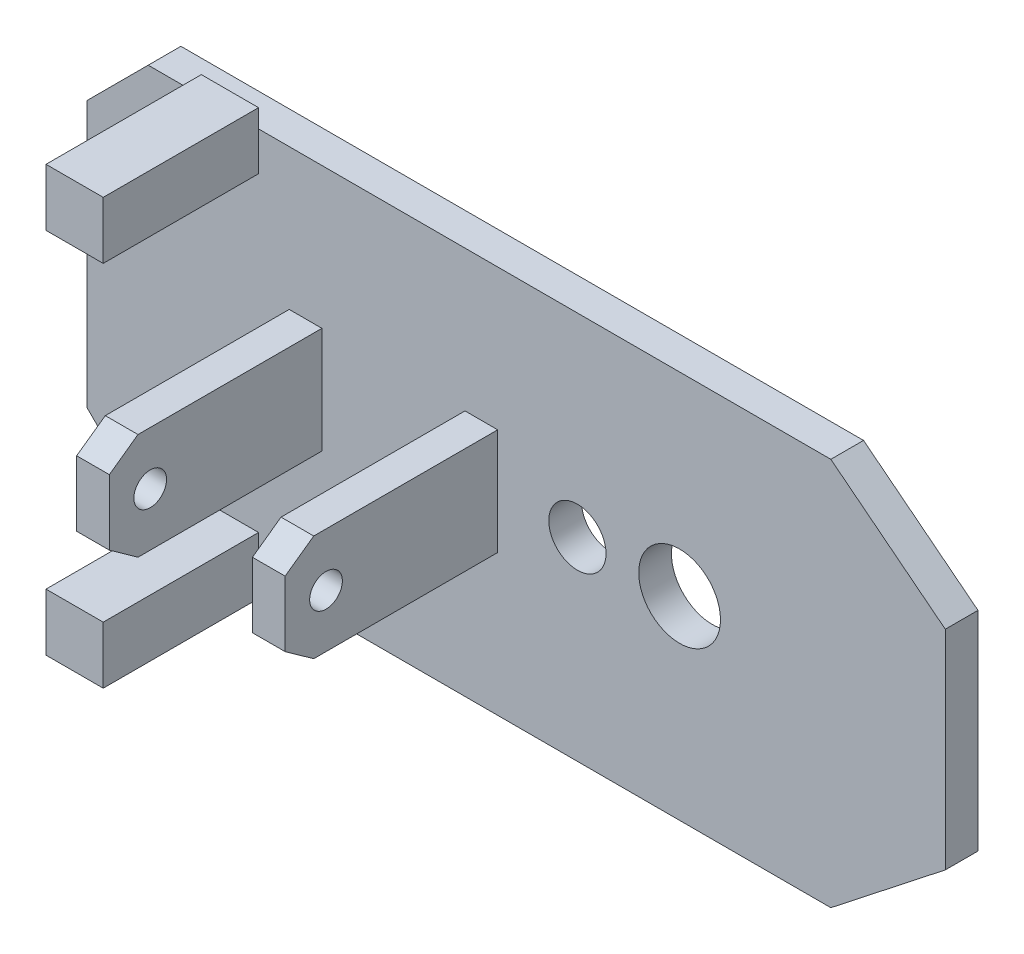
ISO-10303-21;
HEADER;
FILE_DESCRIPTION(('STEP AP214'),'2;1');
FILE_NAME('part.step','',(''),(''),'','','');
FILE_SCHEMA(('AUTOMOTIVE_DESIGN { 1 0 10303 214 1 1 1 1 }'));
ENDSEC;
DATA;
#1=APPLICATION_CONTEXT('core data for automotive mechanical design processes');
#2=APPLICATION_PROTOCOL_DEFINITION('international standard','automotive_design',2000,#1);
#3=PRODUCT_CONTEXT('',#1,'mechanical');
#4=PRODUCT('Part','Part','',(#3));
#5=PRODUCT_RELATED_PRODUCT_CATEGORY('part','',(#4));
#6=PRODUCT_DEFINITION_FORMATION('','',#4);
#7=PRODUCT_DEFINITION_CONTEXT('part definition',#1,'design');
#8=PRODUCT_DEFINITION('design','',#6,#7);
#9=PRODUCT_DEFINITION_SHAPE('','',#8);
#10=(LENGTH_UNIT() NAMED_UNIT(*) SI_UNIT(.MILLI.,.METRE.));
#11=(NAMED_UNIT(*) PLANE_ANGLE_UNIT() SI_UNIT($,.RADIAN.));
#12=(NAMED_UNIT(*) SI_UNIT($,.STERADIAN.) SOLID_ANGLE_UNIT());
#13=UNCERTAINTY_MEASURE_WITH_UNIT(LENGTH_MEASURE(1.E-05),#10,'distance_accuracy_value','');
#14=(GEOMETRIC_REPRESENTATION_CONTEXT(3) GLOBAL_UNCERTAINTY_ASSIGNED_CONTEXT((#13)) GLOBAL_UNIT_ASSIGNED_CONTEXT((#10,
#11,#12)) REPRESENTATION_CONTEXT('',''));
#15=CARTESIAN_POINT('',(0.,0.,0.));
#16=DIRECTION('',(0.,0.,1.));
#17=DIRECTION('',(1.,0.,0.));
#18=AXIS2_PLACEMENT_3D('',#15,#16,#17);
#19=CARTESIAN_POINT('',(0.,0.,-42.));
#20=DIRECTION('',(0.,0.,-1.));
#21=DIRECTION('',(-1.,0.,0.));
#22=AXIS2_PLACEMENT_3D('',#19,#20,#21);
#23=PLANE('',#22);
#24=DIRECTION('',(0.,1.,0.));
#25=VECTOR('',#24,1.);
#26=CARTESIAN_POINT('',(-17.5,-13.,-42.));
#27=LINE('',#26,#25);
#28=CARTESIAN_POINT('',(-17.5,-13.,-42.));
#29=VERTEX_POINT('',#28);
#30=CARTESIAN_POINT('',(-17.5,13.,-42.));
#31=VERTEX_POINT('',#30);
#32=EDGE_CURVE('E310',#29,#31,#27,.T.);
#33=ORIENTED_EDGE('',*,*,#32,.F.);
#34=DIRECTION('',(-1.,0.,0.));
#35=VECTOR('',#34,1.);
#36=CARTESIAN_POINT('',(-17.5,-13.,-42.));
#37=LINE('',#36,#35);
#38=CARTESIAN_POINT('',(-25.5,-13.,-42.));
#39=VERTEX_POINT('',#38);
#40=EDGE_CURVE('E350',#29,#39,#37,.T.);
#41=ORIENTED_EDGE('',*,*,#40,.T.);
#42=DIRECTION('',(0.,1.,0.));
#43=VECTOR('',#42,1.);
#44=CARTESIAN_POINT('',(-25.5,-13.,-42.));
#45=LINE('',#44,#43);
#46=CARTESIAN_POINT('',(-25.5,13.,-42.));
#47=VERTEX_POINT('',#46);
#48=EDGE_CURVE('E322',#39,#47,#45,.T.);
#49=ORIENTED_EDGE('',*,*,#48,.T.);
#50=DIRECTION('',(-1.,0.,0.));
#51=VECTOR('',#50,1.);
#52=CARTESIAN_POINT('',(-17.5,13.,-42.));
#53=LINE('',#52,#51);
#54=EDGE_CURVE('E343',#31,#47,#53,.T.);
#55=ORIENTED_EDGE('',*,*,#54,.F.);
#56=EDGE_LOOP('',(#33,#41,#49,#55));
#57=FACE_BOUND('',#56,.T.);
#58=DIRECTION('',(-1.,0.,0.));
#59=VECTOR('',#58,1.);
#60=CARTESIAN_POINT('',(25.5,-13.,-42.));
#61=LINE('',#60,#59);
#62=CARTESIAN_POINT('',(25.5,-13.,-42.));
#63=VERTEX_POINT('',#62);
#64=CARTESIAN_POINT('',(17.5,-13.,-42.));
#65=VERTEX_POINT('',#64);
#66=EDGE_CURVE('E393',#63,#65,#61,.T.);
#67=ORIENTED_EDGE('',*,*,#66,.T.);
#68=DIRECTION('',(0.,1.,0.));
#69=VECTOR('',#68,1.);
#70=CARTESIAN_POINT('',(17.5,-13.,-42.));
#71=LINE('',#70,#69);
#72=CARTESIAN_POINT('',(17.5,13.,-42.));
#73=VERTEX_POINT('',#72);
#74=EDGE_CURVE('E371',#65,#73,#71,.T.);
#75=ORIENTED_EDGE('',*,*,#74,.T.);
#76=DIRECTION('',(-1.,0.,0.));
#77=VECTOR('',#76,1.);
#78=CARTESIAN_POINT('',(25.5,13.,-42.));
#79=LINE('',#78,#77);
#80=CARTESIAN_POINT('',(25.5,13.,-42.));
#81=VERTEX_POINT('',#80);
#82=EDGE_CURVE('E395',#81,#73,#79,.T.);
#83=ORIENTED_EDGE('',*,*,#82,.F.);
#84=DIRECTION('',(0.,1.,0.));
#85=VECTOR('',#84,1.);
#86=CARTESIAN_POINT('',(25.5,-13.,-42.));
#87=LINE('',#86,#85);
#88=EDGE_CURVE('E359',#63,#81,#87,.T.);
#89=ORIENTED_EDGE('',*,*,#88,.F.);
#90=EDGE_LOOP('',(#67,#75,#83,#89));
#91=FACE_BOUND('',#90,.T.);
#92=CARTESIAN_POINT('',(70.,0.,-42.));
#93=DIRECTION('',(0.,0.,1.));
#94=DIRECTION('',(1.,0.,0.));
#95=AXIS2_PLACEMENT_3D('',#92,#93,#94);
#96=CIRCLE('',#95,9.99999999999999);
#97=CARTESIAN_POINT('',(80.,0.,-42.));
#98=VERTEX_POINT('',#97);
#99=EDGE_CURVE('E404',#98,#98,#96,.T.);
#100=ORIENTED_EDGE('',*,*,#99,.F.);
#101=EDGE_LOOP('',(#100));
#102=FACE_BOUND('',#101,.T.);
#103=CARTESIAN_POINT('',(45.,0.,-42.));
#104=DIRECTION('',(0.,0.,1.));
#105=DIRECTION('',(1.,0.,0.));
#106=AXIS2_PLACEMENT_3D('',#103,#104,#105);
#107=CIRCLE('',#106,7.);
#108=CARTESIAN_POINT('',(52.,0.,-42.));
#109=VERTEX_POINT('',#108);
#110=EDGE_CURVE('E397',#109,#109,#107,.T.);
#111=ORIENTED_EDGE('',*,*,#110,.F.);
#112=EDGE_LOOP('',(#111));
#113=FACE_BOUND('',#112,.T.);
#114=DIRECTION('',(0.,-1.,0.));
#115=VECTOR('',#114,1.);
#116=CARTESIAN_POINT('',(-47.,-38.,-42.));
#117=LINE('',#116,#115);
#118=CARTESIAN_POINT('',(-47.,-38.,-42.));
#119=VERTEX_POINT('',#118);
#120=CARTESIAN_POINT('',(-47.,-47.5,-42.));
#121=VERTEX_POINT('',#120);
#122=EDGE_CURVE('E534',#119,#121,#117,.T.);
#123=ORIENTED_EDGE('',*,*,#122,.F.);
#124=DIRECTION('',(-1.,0.,0.));
#125=VECTOR('',#124,1.);
#126=CARTESIAN_POINT('',(-33.,-38.,-42.));
#127=LINE('',#126,#125);
#128=CARTESIAN_POINT('',(-33.,-38.,-42.));
#129=VERTEX_POINT('',#128);
#130=EDGE_CURVE('E59',#129,#119,#127,.T.);
#131=ORIENTED_EDGE('',*,*,#130,.F.);
#132=DIRECTION('',(0.,1.,0.));
#133=VECTOR('',#132,1.);
#134=CARTESIAN_POINT('',(-33.,-52.,-42.));
#135=LINE('',#134,#133);
#136=CARTESIAN_POINT('',(-33.,-47.5,-42.));
#137=VERTEX_POINT('',#136);
#138=EDGE_CURVE('E11',#137,#129,#135,.T.);
#139=ORIENTED_EDGE('',*,*,#138,.F.);
#140=DIRECTION('',(1.,0.,0.));
#141=VECTOR('',#140,1.);
#142=CARTESIAN_POINT('',(-60.,-47.5,-42.));
#143=LINE('',#142,#141);
#144=CARTESIAN_POINT('',(107.,-47.5,-42.));
#145=VERTEX_POINT('',#144);
#146=EDGE_CURVE('E414',#137,#145,#143,.T.);
#147=ORIENTED_EDGE('',*,*,#146,.T.);
#148=DIRECTION('',(0.786318338822423,0.617821551931904,0.));
#149=VECTOR('',#148,1.);
#150=CARTESIAN_POINT('',(107.,-47.5,-42.));
#151=LINE('',#150,#149);
#152=CARTESIAN_POINT('',(135.,-25.5,-42.));
#153=VERTEX_POINT('',#152);
#154=EDGE_CURVE('E416',#145,#153,#151,.T.);
#155=ORIENTED_EDGE('',*,*,#154,.T.);
#156=DIRECTION('',(0.,1.,0.));
#157=VECTOR('',#156,1.);
#158=CARTESIAN_POINT('',(135.,-25.5,-42.));
#159=LINE('',#158,#157);
#160=CARTESIAN_POINT('',(135.,25.5,-42.));
#161=VERTEX_POINT('',#160);
#162=EDGE_CURVE('E423',#153,#161,#159,.T.);
#163=ORIENTED_EDGE('',*,*,#162,.T.);
#164=DIRECTION('',(-0.786318338822423,0.617821551931904,0.));
#165=VECTOR('',#164,1.);
#166=CARTESIAN_POINT('',(135.,25.5,-42.));
#167=LINE('',#166,#165);
#168=CARTESIAN_POINT('',(107.,47.5,-42.));
#169=VERTEX_POINT('',#168);
#170=EDGE_CURVE('E421',#161,#169,#167,.T.);
#171=ORIENTED_EDGE('',*,*,#170,.T.);
#172=DIRECTION('',(-1.,0.,0.));
#173=VECTOR('',#172,1.);
#174=CARTESIAN_POINT('',(107.,47.5,-42.));
#175=LINE('',#174,#173);
#176=CARTESIAN_POINT('',(-32.9999999999999,47.5,-42.));
#177=VERTEX_POINT('',#176);
#178=EDGE_CURVE('E426',#169,#177,#175,.T.);
#179=ORIENTED_EDGE('',*,*,#178,.T.);
#180=DIRECTION('',(0.,1.,0.));
#181=VECTOR('',#180,1.);
#182=CARTESIAN_POINT('',(-33.,38.,-42.));
#183=LINE('',#182,#181);
#184=CARTESIAN_POINT('',(-33.,38.,-42.));
#185=VERTEX_POINT('',#184);
#186=EDGE_CURVE('E283',#185,#177,#183,.T.);
#187=ORIENTED_EDGE('',*,*,#186,.F.);
#188=DIRECTION('',(1.,0.,0.));
#189=VECTOR('',#188,1.);
#190=CARTESIAN_POINT('',(-47.,38.,-42.));
#191=LINE('',#190,#189);
#192=CARTESIAN_POINT('',(-47.,38.,-42.));
#193=VERTEX_POINT('',#192);
#194=EDGE_CURVE('E262',#193,#185,#191,.T.);
#195=ORIENTED_EDGE('',*,*,#194,.F.);
#196=DIRECTION('',(0.,-1.,0.));
#197=VECTOR('',#196,1.);
#198=CARTESIAN_POINT('',(-47.,52.,-42.));
#199=LINE('',#198,#197);
#200=CARTESIAN_POINT('',(-47.,47.5,-42.));
#201=VERTEX_POINT('',#200);
#202=EDGE_CURVE('E47',#201,#193,#199,.T.);
#203=ORIENTED_EDGE('',*,*,#202,.F.);
#204=CARTESIAN_POINT('',(-60.,47.5,-42.));
#205=VERTEX_POINT('',#204);
#206=EDGE_CURVE('E422',#201,#205,#175,.T.);
#207=ORIENTED_EDGE('',*,*,#206,.T.);
#208=DIRECTION('',(-0.707106781186547,-0.707106781186547,0.));
#209=VECTOR('',#208,1.);
#210=CARTESIAN_POINT('',(-60.,47.5,-42.));
#211=LINE('',#210,#209);
#212=CARTESIAN_POINT('',(-75.,32.5,-42.));
#213=VERTEX_POINT('',#212);
#214=EDGE_CURVE('E427',#205,#213,#211,.T.);
#215=ORIENTED_EDGE('',*,*,#214,.T.);
#216=DIRECTION('',(0.,-1.,0.));
#217=VECTOR('',#216,1.);
#218=CARTESIAN_POINT('',(-75.,32.5,-42.));
#219=LINE('',#218,#217);
#220=CARTESIAN_POINT('',(-75.,-32.5,-42.));
#221=VERTEX_POINT('',#220);
#222=EDGE_CURVE('E435',#213,#221,#219,.T.);
#223=ORIENTED_EDGE('',*,*,#222,.T.);
#224=DIRECTION('',(0.707106781186547,-0.707106781186547,0.));
#225=VECTOR('',#224,1.);
#226=CARTESIAN_POINT('',(-75.,-32.5,-42.));
#227=LINE('',#226,#225);
#228=CARTESIAN_POINT('',(-60.,-47.5,-42.));
#229=VERTEX_POINT('',#228);
#230=EDGE_CURVE('E409',#221,#229,#227,.T.);
#231=ORIENTED_EDGE('',*,*,#230,.T.);
#232=EDGE_CURVE('E413',#229,#121,#143,.T.);
#233=ORIENTED_EDGE('',*,*,#232,.T.);
#234=EDGE_LOOP('',(#123,#131,#139,#147,#155,#163,#171,#179,#187,#195,#203,#207,#215,#223,#231,#233));
#235=FACE_BOUND('',#234,.T.);
#236=ADVANCED_FACE('F37',(#57,#91,#102,#113,#235),#23,.F.);
#237=CARTESIAN_POINT('',(0.,0.,-50.));
#238=DIRECTION('',(0.,0.,-1.));
#239=DIRECTION('',(-1.,0.,0.));
#240=AXIS2_PLACEMENT_3D('',#237,#238,#239);
#241=PLANE('',#240);
#242=CARTESIAN_POINT('',(70.,0.,-50.));
#243=DIRECTION('',(0.,0.,1.));
#244=DIRECTION('',(1.,0.,0.));
#245=AXIS2_PLACEMENT_3D('',#242,#243,#244);
#246=CIRCLE('',#245,9.99999999999999);
#247=CARTESIAN_POINT('',(80.,0.,-50.));
#248=VERTEX_POINT('',#247);
#249=EDGE_CURVE('E402',#248,#248,#246,.T.);
#250=ORIENTED_EDGE('',*,*,#249,.T.);
#251=EDGE_LOOP('',(#250));
#252=FACE_BOUND('',#251,.T.);
#253=DIRECTION('',(0.707106781186547,-0.707106781186547,0.));
#254=VECTOR('',#253,1.);
#255=CARTESIAN_POINT('',(-75.,-32.5,-50.));
#256=LINE('',#255,#254);
#257=CARTESIAN_POINT('',(-75.,-32.5,-50.));
#258=VERTEX_POINT('',#257);
#259=CARTESIAN_POINT('',(-60.,-47.5,-50.));
#260=VERTEX_POINT('',#259);
#261=EDGE_CURVE('E410',#258,#260,#256,.T.);
#262=ORIENTED_EDGE('',*,*,#261,.F.);
#263=DIRECTION('',(0.,-1.,0.));
#264=VECTOR('',#263,1.);
#265=CARTESIAN_POINT('',(-75.,32.5,-50.));
#266=LINE('',#265,#264);
#267=CARTESIAN_POINT('',(-75.,32.5,-50.));
#268=VERTEX_POINT('',#267);
#269=EDGE_CURVE('E411',#268,#258,#266,.T.);
#270=ORIENTED_EDGE('',*,*,#269,.F.);
#271=DIRECTION('',(-0.707106781186547,-0.707106781186547,0.));
#272=VECTOR('',#271,1.);
#273=CARTESIAN_POINT('',(-60.,47.5,-50.));
#274=LINE('',#273,#272);
#275=CARTESIAN_POINT('',(-60.,47.5,-50.));
#276=VERTEX_POINT('',#275);
#277=EDGE_CURVE('E450',#276,#268,#274,.T.);
#278=ORIENTED_EDGE('',*,*,#277,.F.);
#279=DIRECTION('',(-1.,0.,0.));
#280=VECTOR('',#279,1.);
#281=CARTESIAN_POINT('',(107.,47.5,-50.));
#282=LINE('',#281,#280);
#283=CARTESIAN_POINT('',(107.,47.5,-50.));
#284=VERTEX_POINT('',#283);
#285=EDGE_CURVE('E443',#284,#276,#282,.T.);
#286=ORIENTED_EDGE('',*,*,#285,.F.);
#287=DIRECTION('',(-0.786318338822423,0.617821551931904,0.));
#288=VECTOR('',#287,1.);
#289=CARTESIAN_POINT('',(135.,25.5,-50.));
#290=LINE('',#289,#288);
#291=CARTESIAN_POINT('',(135.,25.5,-50.));
#292=VERTEX_POINT('',#291);
#293=EDGE_CURVE('E444',#292,#284,#290,.T.);
#294=ORIENTED_EDGE('',*,*,#293,.F.);
#295=DIRECTION('',(0.,1.,0.));
#296=VECTOR('',#295,1.);
#297=CARTESIAN_POINT('',(135.,-25.5,-50.));
#298=LINE('',#297,#296);
#299=CARTESIAN_POINT('',(135.,-25.5,-50.));
#300=VERTEX_POINT('',#299);
#301=EDGE_CURVE('E442',#300,#292,#298,.T.);
#302=ORIENTED_EDGE('',*,*,#301,.F.);
#303=DIRECTION('',(0.786318338822423,0.617821551931904,0.));
#304=VECTOR('',#303,1.);
#305=CARTESIAN_POINT('',(107.,-47.5,-50.));
#306=LINE('',#305,#304);
#307=CARTESIAN_POINT('',(107.,-47.5,-50.));
#308=VERTEX_POINT('',#307);
#309=EDGE_CURVE('E438',#308,#300,#306,.T.);
#310=ORIENTED_EDGE('',*,*,#309,.F.);
#311=DIRECTION('',(1.,0.,0.));
#312=VECTOR('',#311,1.);
#313=CARTESIAN_POINT('',(-60.,-47.5,-50.));
#314=LINE('',#313,#312);
#315=EDGE_CURVE('E440',#260,#308,#314,.T.);
#316=ORIENTED_EDGE('',*,*,#315,.F.);
#317=EDGE_LOOP('',(#262,#270,#278,#286,#294,#302,#310,#316));
#318=FACE_BOUND('',#317,.T.);
#319=CARTESIAN_POINT('',(45.,0.,-50.));
#320=DIRECTION('',(0.,0.,1.));
#321=DIRECTION('',(1.,0.,0.));
#322=AXIS2_PLACEMENT_3D('',#319,#320,#321);
#323=CIRCLE('',#322,7.);
#324=CARTESIAN_POINT('',(52.,0.,-50.));
#325=VERTEX_POINT('',#324);
#326=EDGE_CURVE('E400',#325,#325,#323,.T.);
#327=ORIENTED_EDGE('',*,*,#326,.T.);
#328=EDGE_LOOP('',(#327));
#329=FACE_BOUND('',#328,.T.);
#330=ADVANCED_FACE('F513',(#252,#318,#329),#241,.T.);
#331=CARTESIAN_POINT('',(-75.,-32.5,-42.));
#332=DIRECTION('',(0.707106781186547,0.707106781186547,0.));
#333=DIRECTION('',(-0.707106781186548,0.707106781186548,0.));
#334=AXIS2_PLACEMENT_3D('',#331,#332,#333);
#335=PLANE('',#334);
#336=ORIENTED_EDGE('',*,*,#261,.T.);
#337=DIRECTION('',(0.,0.,-1.));
#338=VECTOR('',#337,1.);
#339=CARTESIAN_POINT('',(-60.,-47.5,-42.));
#340=LINE('',#339,#338);
#341=EDGE_CURVE('E42',#229,#260,#340,.T.);
#342=ORIENTED_EDGE('',*,*,#341,.F.);
#343=ORIENTED_EDGE('',*,*,#230,.F.);
#344=DIRECTION('',(0.,0.,-1.));
#345=VECTOR('',#344,1.);
#346=CARTESIAN_POINT('',(-75.,-32.5,-42.));
#347=LINE('',#346,#345);
#348=EDGE_CURVE('E432',#221,#258,#347,.T.);
#349=ORIENTED_EDGE('',*,*,#348,.T.);
#350=EDGE_LOOP('',(#336,#342,#343,#349));
#351=FACE_BOUND('',#350,.T.);
#352=ADVANCED_FACE('F45',(#351),#335,.F.);
#353=CARTESIAN_POINT('',(-60.,-47.5,-42.));
#354=DIRECTION('',(0.,1.,0.));
#355=DIRECTION('',(0.,0.,1.));
#356=AXIS2_PLACEMENT_3D('',#353,#354,#355);
#357=PLANE('',#356);
#358=ORIENTED_EDGE('',*,*,#315,.T.);
#359=DIRECTION('',(0.,0.,-1.));
#360=VECTOR('',#359,1.);
#361=CARTESIAN_POINT('',(107.,-47.5,-42.));
#362=LINE('',#361,#360);
#363=EDGE_CURVE('E467',#145,#308,#362,.T.);
#364=ORIENTED_EDGE('',*,*,#363,.F.);
#365=ORIENTED_EDGE('',*,*,#146,.F.);
#366=EDGE_CURVE('E420',#121,#137,#143,.T.);
#367=ORIENTED_EDGE('',*,*,#366,.F.);
#368=ORIENTED_EDGE('',*,*,#232,.F.);
#369=ORIENTED_EDGE('',*,*,#341,.T.);
#370=EDGE_LOOP('',(#358,#364,#365,#367,#368,#369));
#371=FACE_BOUND('',#370,.T.);
#372=ADVANCED_FACE('F517',(#371),#357,.F.);
#373=CARTESIAN_POINT('',(107.,-47.5,-42.));
#374=DIRECTION('',(-0.617821551931904,0.786318338822423,0.));
#375=DIRECTION('',(-0.786318338822423,-0.617821551931904,0.));
#376=AXIS2_PLACEMENT_3D('',#373,#374,#375);
#377=PLANE('',#376);
#378=ORIENTED_EDGE('',*,*,#309,.T.);
#379=DIRECTION('',(0.,0.,-1.));
#380=VECTOR('',#379,1.);
#381=CARTESIAN_POINT('',(135.,-25.5,-42.));
#382=LINE('',#381,#380);
#383=EDGE_CURVE('E463',#153,#300,#382,.T.);
#384=ORIENTED_EDGE('',*,*,#383,.F.);
#385=ORIENTED_EDGE('',*,*,#154,.F.);
#386=ORIENTED_EDGE('',*,*,#363,.T.);
#387=EDGE_LOOP('',(#378,#384,#385,#386));
#388=FACE_BOUND('',#387,.T.);
#389=ADVANCED_FACE('F522',(#388),#377,.F.);
#390=CARTESIAN_POINT('',(135.,-25.5,-42.));
#391=DIRECTION('',(-1.,0.,0.));
#392=DIRECTION('',(0.,0.,1.));
#393=AXIS2_PLACEMENT_3D('',#390,#391,#392);
#394=PLANE('',#393);
#395=ORIENTED_EDGE('',*,*,#301,.T.);
#396=DIRECTION('',(0.,0.,-1.));
#397=VECTOR('',#396,1.);
#398=CARTESIAN_POINT('',(135.,25.5,-42.));
#399=LINE('',#398,#397);
#400=EDGE_CURVE('E461',#161,#292,#399,.T.);
#401=ORIENTED_EDGE('',*,*,#400,.F.);
#402=ORIENTED_EDGE('',*,*,#162,.F.);
#403=ORIENTED_EDGE('',*,*,#383,.T.);
#404=EDGE_LOOP('',(#395,#401,#402,#403));
#405=FACE_BOUND('',#404,.T.);
#406=ADVANCED_FACE('F577',(#405),#394,.F.);
#407=CARTESIAN_POINT('',(135.,25.5,-42.));
#408=DIRECTION('',(-0.617821551931904,-0.786318338822423,0.));
#409=DIRECTION('',(0.786318338822423,-0.617821551931904,0.));
#410=AXIS2_PLACEMENT_3D('',#407,#408,#409);
#411=PLANE('',#410);
#412=ORIENTED_EDGE('',*,*,#293,.T.);
#413=DIRECTION('',(0.,0.,-1.));
#414=VECTOR('',#413,1.);
#415=CARTESIAN_POINT('',(107.,47.5,-42.));
#416=LINE('',#415,#414);
#417=EDGE_CURVE('E456',#169,#284,#416,.T.);
#418=ORIENTED_EDGE('',*,*,#417,.F.);
#419=ORIENTED_EDGE('',*,*,#170,.F.);
#420=ORIENTED_EDGE('',*,*,#400,.T.);
#421=EDGE_LOOP('',(#412,#418,#419,#420));
#422=FACE_BOUND('',#421,.T.);
#423=ADVANCED_FACE('F572',(#422),#411,.F.);
#424=CARTESIAN_POINT('',(107.,47.5,-42.));
#425=DIRECTION('',(0.,-1.,0.));
#426=DIRECTION('',(0.,0.,-1.));
#427=AXIS2_PLACEMENT_3D('',#424,#425,#426);
#428=PLANE('',#427);
#429=ORIENTED_EDGE('',*,*,#285,.T.);
#430=DIRECTION('',(0.,0.,-1.));
#431=VECTOR('',#430,1.);
#432=CARTESIAN_POINT('',(-60.,47.5,-42.));
#433=LINE('',#432,#431);
#434=EDGE_CURVE('E454',#205,#276,#433,.T.);
#435=ORIENTED_EDGE('',*,*,#434,.F.);
#436=ORIENTED_EDGE('',*,*,#206,.F.);
#437=EDGE_CURVE('E429',#177,#201,#175,.T.);
#438=ORIENTED_EDGE('',*,*,#437,.F.);
#439=ORIENTED_EDGE('',*,*,#178,.F.);
#440=ORIENTED_EDGE('',*,*,#417,.T.);
#441=EDGE_LOOP('',(#429,#435,#436,#438,#439,#440));
#442=FACE_BOUND('',#441,.T.);
#443=ADVANCED_FACE('F501',(#442),#428,.F.);
#444=CARTESIAN_POINT('',(-60.,47.5,-42.));
#445=DIRECTION('',(0.707106781186547,-0.707106781186547,0.));
#446=DIRECTION('',(0.707106781186548,0.707106781186548,0.));
#447=AXIS2_PLACEMENT_3D('',#444,#445,#446);
#448=PLANE('',#447);
#449=ORIENTED_EDGE('',*,*,#277,.T.);
#450=DIRECTION('',(0.,0.,-1.));
#451=VECTOR('',#450,1.);
#452=CARTESIAN_POINT('',(-75.,32.5,-42.));
#453=LINE('',#452,#451);
#454=EDGE_CURVE('E455',#213,#268,#453,.T.);
#455=ORIENTED_EDGE('',*,*,#454,.F.);
#456=ORIENTED_EDGE('',*,*,#214,.F.);
#457=ORIENTED_EDGE('',*,*,#434,.T.);
#458=EDGE_LOOP('',(#449,#455,#456,#457));
#459=FACE_BOUND('',#458,.T.);
#460=ADVANCED_FACE('F504',(#459),#448,.F.);
#461=CARTESIAN_POINT('',(-75.,32.5,-42.));
#462=DIRECTION('',(1.,0.,0.));
#463=DIRECTION('',(0.,0.,-1.));
#464=AXIS2_PLACEMENT_3D('',#461,#462,#463);
#465=PLANE('',#464);
#466=ORIENTED_EDGE('',*,*,#269,.T.);
#467=ORIENTED_EDGE('',*,*,#348,.F.);
#468=ORIENTED_EDGE('',*,*,#222,.F.);
#469=ORIENTED_EDGE('',*,*,#454,.T.);
#470=EDGE_LOOP('',(#466,#467,#468,#469));
#471=FACE_BOUND('',#470,.T.);
#472=ADVANCED_FACE('F509',(#471),#465,.F.);
#473=CARTESIAN_POINT('',(70.,0.,-42.));
#474=DIRECTION('',(0.,0.,-1.));
#475=DIRECTION('',(-1.,0.,0.));
#476=AXIS2_PLACEMENT_3D('',#473,#474,#475);
#477=CYLINDRICAL_SURFACE('',#476,9.99999999999999);
#478=ORIENTED_EDGE('',*,*,#99,.T.);
#479=EDGE_LOOP('',(#478));
#480=FACE_BOUND('',#479,.T.);
#481=ORIENTED_EDGE('',*,*,#249,.F.);
#482=EDGE_LOOP('',(#481));
#483=FACE_BOUND('',#482,.T.);
#484=ADVANCED_FACE('F563',(#480,#483),#477,.F.);
#485=CARTESIAN_POINT('',(45.,0.,-42.));
#486=DIRECTION('',(0.,0.,-1.));
#487=DIRECTION('',(-1.,0.,0.));
#488=AXIS2_PLACEMENT_3D('',#485,#486,#487);
#489=CYLINDRICAL_SURFACE('',#488,7.);
#490=ORIENTED_EDGE('',*,*,#110,.T.);
#491=EDGE_LOOP('',(#490));
#492=FACE_BOUND('',#491,.T.);
#493=ORIENTED_EDGE('',*,*,#326,.F.);
#494=EDGE_LOOP('',(#493));
#495=FACE_BOUND('',#494,.T.);
#496=ADVANCED_FACE('F621',(#492,#495),#489,.F.);
#497=CARTESIAN_POINT('',(25.5,0.,0.));
#498=DIRECTION('',(1.,0.,0.));
#499=DIRECTION('',(0.,0.,-1.));
#500=AXIS2_PLACEMENT_3D('',#497,#498,#499);
#501=PLANE('',#500);
#502=DIRECTION('',(0.,0.,-1.));
#503=VECTOR('',#502,1.);
#504=CARTESIAN_POINT('',(25.5,-13.,3.));
#505=LINE('',#504,#503);
#506=CARTESIAN_POINT('',(25.5,-13.,3.));
#507=VERTEX_POINT('',#506);
#508=EDGE_CURVE('E357',#507,#63,#505,.T.);
#509=ORIENTED_EDGE('',*,*,#508,.T.);
#510=ORIENTED_EDGE('',*,*,#88,.T.);
#511=DIRECTION('',(0.,0.,1.));
#512=VECTOR('',#511,1.);
#513=CARTESIAN_POINT('',(25.5,13.,-42.));
#514=LINE('',#513,#512);
#515=CARTESIAN_POINT('',(25.5,13.,3.));
#516=VERTEX_POINT('',#515);
#517=EDGE_CURVE('E363',#81,#516,#514,.T.);
#518=ORIENTED_EDGE('',*,*,#517,.T.);
#519=DIRECTION('',(0.,-0.581238193719096,0.813733471206735));
#520=VECTOR('',#519,1.);
#521=CARTESIAN_POINT('',(25.5,13.,3.));
#522=LINE('',#521,#520);
#523=CARTESIAN_POINT('',(25.5,8.,10.));
#524=VERTEX_POINT('',#523);
#525=EDGE_CURVE('E361',#516,#524,#522,.T.);
#526=ORIENTED_EDGE('',*,*,#525,.T.);
#527=DIRECTION('',(0.,-1.,0.));
#528=VECTOR('',#527,1.);
#529=CARTESIAN_POINT('',(25.5,8.,10.));
#530=LINE('',#529,#528);
#531=CARTESIAN_POINT('',(25.5,-8.,10.));
#532=VERTEX_POINT('',#531);
#533=EDGE_CURVE('E364',#524,#532,#530,.T.);
#534=ORIENTED_EDGE('',*,*,#533,.T.);
#535=DIRECTION('',(0.,-0.581238193719096,-0.813733471206735));
#536=VECTOR('',#535,1.);
#537=CARTESIAN_POINT('',(25.5,-8.,10.));
#538=LINE('',#537,#536);
#539=EDGE_CURVE('E370',#532,#507,#538,.T.);
#540=ORIENTED_EDGE('',*,*,#539,.T.);
#541=EDGE_LOOP('',(#509,#510,#518,#526,#534,#540));
#542=FACE_BOUND('',#541,.T.);
#543=CARTESIAN_POINT('',(25.5,0.,0.));
#544=DIRECTION('',(1.,0.,0.));
#545=DIRECTION('',(0.,0.,-1.));
#546=AXIS2_PLACEMENT_3D('',#543,#544,#545);
#547=CIRCLE('',#546,4.);
#548=CARTESIAN_POINT('',(25.5,0.,-4.));
#549=VERTEX_POINT('',#548);
#550=EDGE_CURVE('E348',#549,#549,#547,.T.);
#551=ORIENTED_EDGE('',*,*,#550,.F.);
#552=EDGE_LOOP('',(#551));
#553=FACE_BOUND('',#552,.T.);
#554=ADVANCED_FACE('F632',(#542,#553),#501,.T.);
#555=CARTESIAN_POINT('',(17.5,0.,0.));
#556=DIRECTION('',(1.,0.,0.));
#557=DIRECTION('',(0.,0.,-1.));
#558=AXIS2_PLACEMENT_3D('',#555,#556,#557);
#559=PLANE('',#558);
#560=DIRECTION('',(0.,0.,-1.));
#561=VECTOR('',#560,1.);
#562=CARTESIAN_POINT('',(17.5,-13.,3.));
#563=LINE('',#562,#561);
#564=CARTESIAN_POINT('',(17.5,-13.,3.));
#565=VERTEX_POINT('',#564);
#566=EDGE_CURVE('E352',#565,#65,#563,.T.);
#567=ORIENTED_EDGE('',*,*,#566,.F.);
#568=DIRECTION('',(0.,-0.581238193719096,-0.813733471206735));
#569=VECTOR('',#568,1.);
#570=CARTESIAN_POINT('',(17.5,-8.,10.));
#571=LINE('',#570,#569);
#572=CARTESIAN_POINT('',(17.5,-8.,10.));
#573=VERTEX_POINT('',#572);
#574=EDGE_CURVE('E356',#573,#565,#571,.T.);
#575=ORIENTED_EDGE('',*,*,#574,.F.);
#576=DIRECTION('',(0.,-1.,0.));
#577=VECTOR('',#576,1.);
#578=CARTESIAN_POINT('',(17.5,8.,10.));
#579=LINE('',#578,#577);
#580=CARTESIAN_POINT('',(17.5,8.,10.));
#581=VERTEX_POINT('',#580);
#582=EDGE_CURVE('E378',#581,#573,#579,.T.);
#583=ORIENTED_EDGE('',*,*,#582,.F.);
#584=DIRECTION('',(0.,-0.581238193719096,0.813733471206735));
#585=VECTOR('',#584,1.);
#586=CARTESIAN_POINT('',(17.5,13.,3.));
#587=LINE('',#586,#585);
#588=CARTESIAN_POINT('',(17.5,13.,3.));
#589=VERTEX_POINT('',#588);
#590=EDGE_CURVE('E376',#589,#581,#587,.T.);
#591=ORIENTED_EDGE('',*,*,#590,.F.);
#592=DIRECTION('',(0.,0.,1.));
#593=VECTOR('',#592,1.);
#594=CARTESIAN_POINT('',(17.5,13.,-42.));
#595=LINE('',#594,#593);
#596=EDGE_CURVE('E372',#73,#589,#595,.T.);
#597=ORIENTED_EDGE('',*,*,#596,.F.);
#598=ORIENTED_EDGE('',*,*,#74,.F.);
#599=EDGE_LOOP('',(#567,#575,#583,#591,#597,#598));
#600=FACE_BOUND('',#599,.T.);
#601=CARTESIAN_POINT('',(17.5,0.,0.));
#602=DIRECTION('',(1.,0.,0.));
#603=DIRECTION('',(0.,0.,-1.));
#604=AXIS2_PLACEMENT_3D('',#601,#602,#603);
#605=CIRCLE('',#604,4.);
#606=CARTESIAN_POINT('',(17.5,0.,-4.));
#607=VERTEX_POINT('',#606);
#608=EDGE_CURVE('E349',#607,#607,#605,.T.);
#609=ORIENTED_EDGE('',*,*,#608,.T.);
#610=EDGE_LOOP('',(#609));
#611=FACE_BOUND('',#610,.T.);
#612=ADVANCED_FACE('F640',(#600,#611),#559,.F.);
#613=CARTESIAN_POINT('',(25.5,-13.,3.));
#614=DIRECTION('',(0.,1.,0.));
#615=DIRECTION('',(0.,0.,1.));
#616=AXIS2_PLACEMENT_3D('',#613,#614,#615);
#617=PLANE('',#616);
#618=ORIENTED_EDGE('',*,*,#566,.T.);
#619=ORIENTED_EDGE('',*,*,#66,.F.);
#620=ORIENTED_EDGE('',*,*,#508,.F.);
#621=DIRECTION('',(-1.,0.,0.));
#622=VECTOR('',#621,1.);
#623=CARTESIAN_POINT('',(25.5,-13.,3.));
#624=LINE('',#623,#622);
#625=EDGE_CURVE('E369',#507,#565,#624,.T.);
#626=ORIENTED_EDGE('',*,*,#625,.T.);
#627=EDGE_LOOP('',(#618,#619,#620,#626));
#628=FACE_BOUND('',#627,.T.);
#629=ADVANCED_FACE('F648',(#628),#617,.F.);
#630=CARTESIAN_POINT('',(25.5,13.,-42.));
#631=DIRECTION('',(0.,-1.,0.));
#632=DIRECTION('',(0.,0.,-1.));
#633=AXIS2_PLACEMENT_3D('',#630,#631,#632);
#634=PLANE('',#633);
#635=ORIENTED_EDGE('',*,*,#596,.T.);
#636=DIRECTION('',(-1.,0.,0.));
#637=VECTOR('',#636,1.);
#638=CARTESIAN_POINT('',(25.5,13.,3.));
#639=LINE('',#638,#637);
#640=EDGE_CURVE('E386',#516,#589,#639,.T.);
#641=ORIENTED_EDGE('',*,*,#640,.F.);
#642=ORIENTED_EDGE('',*,*,#517,.F.);
#643=ORIENTED_EDGE('',*,*,#82,.T.);
#644=EDGE_LOOP('',(#635,#641,#642,#643));
#645=FACE_BOUND('',#644,.T.);
#646=ADVANCED_FACE('F660',(#645),#634,.F.);
#647=CARTESIAN_POINT('',(25.5,13.,3.));
#648=DIRECTION('',(0.,-0.813733471206735,-0.581238193719096));
#649=DIRECTION('',(0.,0.581238193719096,-0.813733471206735));
#650=AXIS2_PLACEMENT_3D('',#647,#648,#649);
#651=PLANE('',#650);
#652=ORIENTED_EDGE('',*,*,#590,.T.);
#653=DIRECTION('',(-1.,0.,0.));
#654=VECTOR('',#653,1.);
#655=CARTESIAN_POINT('',(25.5,8.,10.));
#656=LINE('',#655,#654);
#657=EDGE_CURVE('E387',#524,#581,#656,.T.);
#658=ORIENTED_EDGE('',*,*,#657,.F.);
#659=ORIENTED_EDGE('',*,*,#525,.F.);
#660=ORIENTED_EDGE('',*,*,#640,.T.);
#661=EDGE_LOOP('',(#652,#658,#659,#660));
#662=FACE_BOUND('',#661,.T.);
#663=ADVANCED_FACE('F666',(#662),#651,.F.);
#664=CARTESIAN_POINT('',(25.5,8.,10.));
#665=DIRECTION('',(0.,0.,-1.));
#666=DIRECTION('',(-1.,0.,0.));
#667=AXIS2_PLACEMENT_3D('',#664,#665,#666);
#668=PLANE('',#667);
#669=ORIENTED_EDGE('',*,*,#582,.T.);
#670=DIRECTION('',(-1.,0.,0.));
#671=VECTOR('',#670,1.);
#672=CARTESIAN_POINT('',(25.5,-8.,10.));
#673=LINE('',#672,#671);
#674=EDGE_CURVE('E382',#532,#573,#673,.T.);
#675=ORIENTED_EDGE('',*,*,#674,.F.);
#676=ORIENTED_EDGE('',*,*,#533,.F.);
#677=ORIENTED_EDGE('',*,*,#657,.T.);
#678=EDGE_LOOP('',(#669,#675,#676,#677));
#679=FACE_BOUND('',#678,.T.);
#680=ADVANCED_FACE('F674',(#679),#668,.F.);
#681=CARTESIAN_POINT('',(25.5,-8.,10.));
#682=DIRECTION('',(0.,0.813733471206735,-0.581238193719096));
#683=DIRECTION('',(0.,0.581238193719096,0.813733471206735));
#684=AXIS2_PLACEMENT_3D('',#681,#682,#683);
#685=PLANE('',#684);
#686=ORIENTED_EDGE('',*,*,#574,.T.);
#687=ORIENTED_EDGE('',*,*,#625,.F.);
#688=ORIENTED_EDGE('',*,*,#539,.F.);
#689=ORIENTED_EDGE('',*,*,#674,.T.);
#690=EDGE_LOOP('',(#686,#687,#688,#689));
#691=FACE_BOUND('',#690,.T.);
#692=ADVANCED_FACE('F683',(#691),#685,.F.);
#693=CARTESIAN_POINT('',(25.5,0.,0.));
#694=DIRECTION('',(-1.,0.,0.));
#695=DIRECTION('',(0.,0.,1.));
#696=AXIS2_PLACEMENT_3D('',#693,#694,#695);
#697=CYLINDRICAL_SURFACE('',#696,4.);
#698=ORIENTED_EDGE('',*,*,#550,.T.);
#699=EDGE_LOOP('',(#698));
#700=FACE_BOUND('',#699,.T.);
#701=ORIENTED_EDGE('',*,*,#608,.F.);
#702=EDGE_LOOP('',(#701));
#703=FACE_BOUND('',#702,.T.);
#704=ADVANCED_FACE('F691',(#700,#703),#697,.F.);
#705=CARTESIAN_POINT('',(-17.5,0.,0.));
#706=DIRECTION('',(1.,0.,0.));
#707=DIRECTION('',(0.,0.,-1.));
#708=AXIS2_PLACEMENT_3D('',#705,#706,#707);
#709=PLANE('',#708);
#710=DIRECTION('',(0.,0.,-1.));
#711=VECTOR('',#710,1.);
#712=CARTESIAN_POINT('',(-17.5,-13.,3.));
#713=LINE('',#712,#711);
#714=CARTESIAN_POINT('',(-17.5,-13.,3.));
#715=VERTEX_POINT('',#714);
#716=EDGE_CURVE('E308',#715,#29,#713,.T.);
#717=ORIENTED_EDGE('',*,*,#716,.T.);
#718=ORIENTED_EDGE('',*,*,#32,.T.);
#719=DIRECTION('',(0.,0.,1.));
#720=VECTOR('',#719,1.);
#721=CARTESIAN_POINT('',(-17.5,13.,-42.));
#722=LINE('',#721,#720);
#723=CARTESIAN_POINT('',(-17.5,13.,3.));
#724=VERTEX_POINT('',#723);
#725=EDGE_CURVE('E311',#31,#724,#722,.T.);
#726=ORIENTED_EDGE('',*,*,#725,.T.);
#727=DIRECTION('',(0.,-0.581238193719096,0.813733471206735));
#728=VECTOR('',#727,1.);
#729=CARTESIAN_POINT('',(-17.5,13.,3.));
#730=LINE('',#729,#728);
#731=CARTESIAN_POINT('',(-17.5,8.,10.));
#732=VERTEX_POINT('',#731);
#733=EDGE_CURVE('E312',#724,#732,#730,.T.);
#734=ORIENTED_EDGE('',*,*,#733,.T.);
#735=DIRECTION('',(0.,-1.,0.));
#736=VECTOR('',#735,1.);
#737=CARTESIAN_POINT('',(-17.5,8.,10.));
#738=LINE('',#737,#736);
#739=CARTESIAN_POINT('',(-17.5,-8.,10.));
#740=VERTEX_POINT('',#739);
#741=EDGE_CURVE('E320',#732,#740,#738,.T.);
#742=ORIENTED_EDGE('',*,*,#741,.T.);
#743=DIRECTION('',(0.,-0.581238193719096,-0.813733471206735));
#744=VECTOR('',#743,1.);
#745=CARTESIAN_POINT('',(-17.5,-8.,10.));
#746=LINE('',#745,#744);
#747=EDGE_CURVE('E317',#740,#715,#746,.T.);
#748=ORIENTED_EDGE('',*,*,#747,.T.);
#749=EDGE_LOOP('',(#717,#718,#726,#734,#742,#748));
#750=FACE_BOUND('',#749,.T.);
#751=CARTESIAN_POINT('',(-17.5,0.,0.));
#752=DIRECTION('',(1.,0.,0.));
#753=DIRECTION('',(0.,0.,-1.));
#754=AXIS2_PLACEMENT_3D('',#751,#752,#753);
#755=CIRCLE('',#754,4.);
#756=CARTESIAN_POINT('',(-17.5,0.,-4.));
#757=VERTEX_POINT('',#756);
#758=EDGE_CURVE('E299',#757,#757,#755,.T.);
#759=ORIENTED_EDGE('',*,*,#758,.F.);
#760=EDGE_LOOP('',(#759));
#761=FACE_BOUND('',#760,.T.);
#762=ADVANCED_FACE('F705',(#750,#761),#709,.T.);
#763=CARTESIAN_POINT('',(-25.5,0.,0.));
#764=DIRECTION('',(1.,0.,0.));
#765=DIRECTION('',(0.,0.,-1.));
#766=AXIS2_PLACEMENT_3D('',#763,#764,#765);
#767=PLANE('',#766);
#768=DIRECTION('',(0.,0.,-1.));
#769=VECTOR('',#768,1.);
#770=CARTESIAN_POINT('',(-25.5,-13.,3.));
#771=LINE('',#770,#769);
#772=CARTESIAN_POINT('',(-25.5,-13.,3.));
#773=VERTEX_POINT('',#772);
#774=EDGE_CURVE('E304',#773,#39,#771,.T.);
#775=ORIENTED_EDGE('',*,*,#774,.F.);
#776=DIRECTION('',(0.,-0.581238193719096,-0.813733471206735));
#777=VECTOR('',#776,1.);
#778=CARTESIAN_POINT('',(-25.5,-8.,10.));
#779=LINE('',#778,#777);
#780=CARTESIAN_POINT('',(-25.5,-8.,10.));
#781=VERTEX_POINT('',#780);
#782=EDGE_CURVE('E309',#781,#773,#779,.T.);
#783=ORIENTED_EDGE('',*,*,#782,.F.);
#784=DIRECTION('',(0.,-1.,0.));
#785=VECTOR('',#784,1.);
#786=CARTESIAN_POINT('',(-25.5,8.,10.));
#787=LINE('',#786,#785);
#788=CARTESIAN_POINT('',(-25.5,8.,10.));
#789=VERTEX_POINT('',#788);
#790=EDGE_CURVE('E329',#789,#781,#787,.T.);
#791=ORIENTED_EDGE('',*,*,#790,.F.);
#792=DIRECTION('',(0.,-0.581238193719096,0.813733471206735));
#793=VECTOR('',#792,1.);
#794=CARTESIAN_POINT('',(-25.5,13.,3.));
#795=LINE('',#794,#793);
#796=CARTESIAN_POINT('',(-25.5,13.,3.));
#797=VERTEX_POINT('',#796);
#798=EDGE_CURVE('E327',#797,#789,#795,.T.);
#799=ORIENTED_EDGE('',*,*,#798,.F.);
#800=DIRECTION('',(0.,0.,1.));
#801=VECTOR('',#800,1.);
#802=CARTESIAN_POINT('',(-25.5,13.,-42.));
#803=LINE('',#802,#801);
#804=EDGE_CURVE('E326',#47,#797,#803,.T.);
#805=ORIENTED_EDGE('',*,*,#804,.F.);
#806=ORIENTED_EDGE('',*,*,#48,.F.);
#807=EDGE_LOOP('',(#775,#783,#791,#799,#805,#806));
#808=FACE_BOUND('',#807,.T.);
#809=CARTESIAN_POINT('',(-25.5,0.,0.));
#810=DIRECTION('',(1.,0.,0.));
#811=DIRECTION('',(0.,0.,-1.));
#812=AXIS2_PLACEMENT_3D('',#809,#810,#811);
#813=CIRCLE('',#812,4.);
#814=CARTESIAN_POINT('',(-25.5,0.,-4.));
#815=VERTEX_POINT('',#814);
#816=EDGE_CURVE('E298',#815,#815,#813,.T.);
#817=ORIENTED_EDGE('',*,*,#816,.T.);
#818=EDGE_LOOP('',(#817));
#819=FACE_BOUND('',#818,.T.);
#820=ADVANCED_FACE('F711',(#808,#819),#767,.F.);
#821=CARTESIAN_POINT('',(-17.5,-13.,3.));
#822=DIRECTION('',(0.,1.,0.));
#823=DIRECTION('',(0.,0.,1.));
#824=AXIS2_PLACEMENT_3D('',#821,#822,#823);
#825=PLANE('',#824);
#826=ORIENTED_EDGE('',*,*,#774,.T.);
#827=ORIENTED_EDGE('',*,*,#40,.F.);
#828=ORIENTED_EDGE('',*,*,#716,.F.);
#829=DIRECTION('',(-1.,0.,0.));
#830=VECTOR('',#829,1.);
#831=CARTESIAN_POINT('',(-17.5,-13.,3.));
#832=LINE('',#831,#830);
#833=EDGE_CURVE('E321',#715,#773,#832,.T.);
#834=ORIENTED_EDGE('',*,*,#833,.T.);
#835=EDGE_LOOP('',(#826,#827,#828,#834));
#836=FACE_BOUND('',#835,.T.);
#837=ADVANCED_FACE('F718',(#836),#825,.F.);
#838=CARTESIAN_POINT('',(-17.5,13.,-42.));
#839=DIRECTION('',(0.,-1.,0.));
#840=DIRECTION('',(0.,0.,-1.));
#841=AXIS2_PLACEMENT_3D('',#838,#839,#840);
#842=PLANE('',#841);
#843=ORIENTED_EDGE('',*,*,#804,.T.);
#844=DIRECTION('',(-1.,0.,0.));
#845=VECTOR('',#844,1.);
#846=CARTESIAN_POINT('',(-17.5,13.,3.));
#847=LINE('',#846,#845);
#848=EDGE_CURVE('E341',#724,#797,#847,.T.);
#849=ORIENTED_EDGE('',*,*,#848,.F.);
#850=ORIENTED_EDGE('',*,*,#725,.F.);
#851=ORIENTED_EDGE('',*,*,#54,.T.);
#852=EDGE_LOOP('',(#843,#849,#850,#851));
#853=FACE_BOUND('',#852,.T.);
#854=ADVANCED_FACE('F728',(#853),#842,.F.);
#855=CARTESIAN_POINT('',(-17.5,13.,3.));
#856=DIRECTION('',(0.,-0.813733471206735,-0.581238193719096));
#857=DIRECTION('',(0.,0.581238193719096,-0.813733471206735));
#858=AXIS2_PLACEMENT_3D('',#855,#856,#857);
#859=PLANE('',#858);
#860=ORIENTED_EDGE('',*,*,#798,.T.);
#861=DIRECTION('',(-1.,0.,0.));
#862=VECTOR('',#861,1.);
#863=CARTESIAN_POINT('',(-17.5,8.,10.));
#864=LINE('',#863,#862);
#865=EDGE_CURVE('E337',#732,#789,#864,.T.);
#866=ORIENTED_EDGE('',*,*,#865,.F.);
#867=ORIENTED_EDGE('',*,*,#733,.F.);
#868=ORIENTED_EDGE('',*,*,#848,.T.);
#869=EDGE_LOOP('',(#860,#866,#867,#868));
#870=FACE_BOUND('',#869,.T.);
#871=ADVANCED_FACE('F737',(#870),#859,.F.);
#872=CARTESIAN_POINT('',(-17.5,8.,10.));
#873=DIRECTION('',(0.,0.,-1.));
#874=DIRECTION('',(-1.,0.,0.));
#875=AXIS2_PLACEMENT_3D('',#872,#873,#874);
#876=PLANE('',#875);
#877=ORIENTED_EDGE('',*,*,#790,.T.);
#878=DIRECTION('',(-1.,0.,0.));
#879=VECTOR('',#878,1.);
#880=CARTESIAN_POINT('',(-17.5,-8.,10.));
#881=LINE('',#880,#879);
#882=EDGE_CURVE('E333',#740,#781,#881,.T.);
#883=ORIENTED_EDGE('',*,*,#882,.F.);
#884=ORIENTED_EDGE('',*,*,#741,.F.);
#885=ORIENTED_EDGE('',*,*,#865,.T.);
#886=EDGE_LOOP('',(#877,#883,#884,#885));
#887=FACE_BOUND('',#886,.T.);
#888=ADVANCED_FACE('F747',(#887),#876,.F.);
#889=CARTESIAN_POINT('',(-17.5,-8.,10.));
#890=DIRECTION('',(0.,0.813733471206735,-0.581238193719096));
#891=DIRECTION('',(0.,0.581238193719096,0.813733471206735));
#892=AXIS2_PLACEMENT_3D('',#889,#890,#891);
#893=PLANE('',#892);
#894=ORIENTED_EDGE('',*,*,#782,.T.);
#895=ORIENTED_EDGE('',*,*,#833,.F.);
#896=ORIENTED_EDGE('',*,*,#747,.F.);
#897=ORIENTED_EDGE('',*,*,#882,.T.);
#898=EDGE_LOOP('',(#894,#895,#896,#897));
#899=FACE_BOUND('',#898,.T.);
#900=ADVANCED_FACE('F756',(#899),#893,.F.);
#901=CARTESIAN_POINT('',(-17.5,0.,0.));
#902=DIRECTION('',(-1.,0.,0.));
#903=DIRECTION('',(0.,0.,1.));
#904=AXIS2_PLACEMENT_3D('',#901,#902,#903);
#905=CYLINDRICAL_SURFACE('',#904,4.);
#906=ORIENTED_EDGE('',*,*,#758,.T.);
#907=EDGE_LOOP('',(#906));
#908=FACE_BOUND('',#907,.T.);
#909=ORIENTED_EDGE('',*,*,#816,.F.);
#910=EDGE_LOOP('',(#909));
#911=FACE_BOUND('',#910,.T.);
#912=ADVANCED_FACE('F764',(#908,#911),#905,.F.);
#913=CARTESIAN_POINT('',(0.,0.,-42.));
#914=DIRECTION('',(0.,0.,1.));
#915=DIRECTION('',(1.,0.,0.));
#916=AXIS2_PLACEMENT_3D('',#913,#914,#915);
#917=PLANE('',#916);
#918=CARTESIAN_POINT('',(-33.,52.,-42.));
#919=VERTEX_POINT('',#918);
#920=EDGE_CURVE('E282',#177,#919,#183,.T.);
#921=ORIENTED_EDGE('',*,*,#920,.F.);
#922=ORIENTED_EDGE('',*,*,#437,.T.);
#923=CARTESIAN_POINT('',(-47.,52.,-42.));
#924=VERTEX_POINT('',#923);
#925=EDGE_CURVE('E261',#924,#201,#199,.T.);
#926=ORIENTED_EDGE('',*,*,#925,.F.);
#927=DIRECTION('',(-1.,0.,0.));
#928=VECTOR('',#927,1.);
#929=CARTESIAN_POINT('',(-33.,52.,-42.));
#930=LINE('',#929,#928);
#931=EDGE_CURVE('E273',#919,#924,#930,.T.);
#932=ORIENTED_EDGE('',*,*,#931,.F.);
#933=EDGE_LOOP('',(#921,#922,#926,#932));
#934=FACE_BOUND('',#933,.T.);
#935=ADVANCED_FACE('F494',(#934),#917,.F.);
#936=CARTESIAN_POINT('',(-47.,52.,-4.));
#937=DIRECTION('',(1.,0.,0.));
#938=DIRECTION('',(0.,0.,-1.));
#939=AXIS2_PLACEMENT_3D('',#936,#937,#938);
#940=PLANE('',#939);
#941=ORIENTED_EDGE('',*,*,#925,.T.);
#942=ORIENTED_EDGE('',*,*,#202,.T.);
#943=DIRECTION('',(0.,0.,-1.));
#944=VECTOR('',#943,1.);
#945=CARTESIAN_POINT('',(-47.,38.,-4.));
#946=LINE('',#945,#944);
#947=CARTESIAN_POINT('',(-47.,38.,-4.));
#948=VERTEX_POINT('',#947);
#949=EDGE_CURVE('E296',#948,#193,#946,.T.);
#950=ORIENTED_EDGE('',*,*,#949,.F.);
#951=DIRECTION('',(0.,-1.,0.));
#952=VECTOR('',#951,1.);
#953=CARTESIAN_POINT('',(-47.,52.,-4.));
#954=LINE('',#953,#952);
#955=CARTESIAN_POINT('',(-47.,52.,-4.));
#956=VERTEX_POINT('',#955);
#957=EDGE_CURVE('E269',#956,#948,#954,.T.);
#958=ORIENTED_EDGE('',*,*,#957,.F.);
#959=DIRECTION('',(0.,0.,-1.));
#960=VECTOR('',#959,1.);
#961=CARTESIAN_POINT('',(-47.,52.,-4.));
#962=LINE('',#961,#960);
#963=EDGE_CURVE('E276',#956,#924,#962,.T.);
#964=ORIENTED_EDGE('',*,*,#963,.T.);
#965=EDGE_LOOP('',(#941,#942,#950,#958,#964));
#966=FACE_BOUND('',#965,.T.);
#967=ADVANCED_FACE('F476',(#966),#940,.F.);
#968=CARTESIAN_POINT('',(-47.,38.,-4.));
#969=DIRECTION('',(0.,1.,0.));
#970=DIRECTION('',(0.,0.,1.));
#971=AXIS2_PLACEMENT_3D('',#968,#969,#970);
#972=PLANE('',#971);
#973=ORIENTED_EDGE('',*,*,#194,.T.);
#974=DIRECTION('',(0.,0.,-1.));
#975=VECTOR('',#974,1.);
#976=CARTESIAN_POINT('',(-33.,38.,-4.));
#977=LINE('',#976,#975);
#978=CARTESIAN_POINT('',(-33.,38.,-4.));
#979=VERTEX_POINT('',#978);
#980=EDGE_CURVE('E291',#979,#185,#977,.T.);
#981=ORIENTED_EDGE('',*,*,#980,.F.);
#982=DIRECTION('',(1.,0.,0.));
#983=VECTOR('',#982,1.);
#984=CARTESIAN_POINT('',(-47.,38.,-4.));
#985=LINE('',#984,#983);
#986=EDGE_CURVE('E272',#948,#979,#985,.T.);
#987=ORIENTED_EDGE('',*,*,#986,.F.);
#988=ORIENTED_EDGE('',*,*,#949,.T.);
#989=EDGE_LOOP('',(#973,#981,#987,#988));
#990=FACE_BOUND('',#989,.T.);
#991=ADVANCED_FACE('F483',(#990),#972,.F.);
#992=CARTESIAN_POINT('',(-33.,38.,-4.));
#993=DIRECTION('',(-1.,0.,0.));
#994=DIRECTION('',(0.,0.,1.));
#995=AXIS2_PLACEMENT_3D('',#992,#993,#994);
#996=PLANE('',#995);
#997=ORIENTED_EDGE('',*,*,#186,.T.);
#998=ORIENTED_EDGE('',*,*,#920,.T.);
#999=DIRECTION('',(0.,0.,-1.));
#1000=VECTOR('',#999,1.);
#1001=CARTESIAN_POINT('',(-33.,52.,-4.));
#1002=LINE('',#1001,#1000);
#1003=CARTESIAN_POINT('',(-33.,52.,-4.));
#1004=VERTEX_POINT('',#1003);
#1005=EDGE_CURVE('E289',#1004,#919,#1002,.T.);
#1006=ORIENTED_EDGE('',*,*,#1005,.F.);
#1007=DIRECTION('',(0.,1.,0.));
#1008=VECTOR('',#1007,1.);
#1009=CARTESIAN_POINT('',(-33.,38.,-4.));
#1010=LINE('',#1009,#1008);
#1011=EDGE_CURVE('E277',#979,#1004,#1010,.T.);
#1012=ORIENTED_EDGE('',*,*,#1011,.F.);
#1013=ORIENTED_EDGE('',*,*,#980,.T.);
#1014=EDGE_LOOP('',(#997,#998,#1006,#1012,#1013));
#1015=FACE_BOUND('',#1014,.T.);
#1016=ADVANCED_FACE('F798',(#1015),#996,.F.);
#1017=CARTESIAN_POINT('',(-33.,52.,-4.));
#1018=DIRECTION('',(0.,-1.,0.));
#1019=DIRECTION('',(0.,0.,-1.));
#1020=AXIS2_PLACEMENT_3D('',#1017,#1018,#1019);
#1021=PLANE('',#1020);
#1022=ORIENTED_EDGE('',*,*,#931,.T.);
#1023=ORIENTED_EDGE('',*,*,#963,.F.);
#1024=DIRECTION('',(-1.,0.,0.));
#1025=VECTOR('',#1024,1.);
#1026=CARTESIAN_POINT('',(-33.,52.,-4.));
#1027=LINE('',#1026,#1025);
#1028=EDGE_CURVE('E279',#1004,#956,#1027,.T.);
#1029=ORIENTED_EDGE('',*,*,#1028,.F.);
#1030=ORIENTED_EDGE('',*,*,#1005,.T.);
#1031=EDGE_LOOP('',(#1022,#1023,#1029,#1030));
#1032=FACE_BOUND('',#1031,.T.);
#1033=ADVANCED_FACE('F806',(#1032),#1021,.F.);
#1034=CARTESIAN_POINT('',(0.,0.,-4.));
#1035=DIRECTION('',(0.,0.,1.));
#1036=DIRECTION('',(1.,0.,0.));
#1037=AXIS2_PLACEMENT_3D('',#1034,#1035,#1036);
#1038=PLANE('',#1037);
#1039=ORIENTED_EDGE('',*,*,#957,.T.);
#1040=ORIENTED_EDGE('',*,*,#986,.T.);
#1041=ORIENTED_EDGE('',*,*,#1011,.T.);
#1042=ORIENTED_EDGE('',*,*,#1028,.T.);
#1043=EDGE_LOOP('',(#1039,#1040,#1041,#1042));
#1044=FACE_BOUND('',#1043,.T.);
#1045=ADVANCED_FACE('F490',(#1044),#1038,.T.);
#1046=CARTESIAN_POINT('',(0.,0.,-42.));
#1047=DIRECTION('',(0.,0.,1.));
#1048=DIRECTION('',(1.,0.,0.));
#1049=AXIS2_PLACEMENT_3D('',#1046,#1047,#1048);
#1050=PLANE('',#1049);
#1051=CARTESIAN_POINT('',(-47.,-52.,-42.));
#1052=VERTEX_POINT('',#1051);
#1053=EDGE_CURVE('E259',#121,#1052,#117,.T.);
#1054=ORIENTED_EDGE('',*,*,#1053,.F.);
#1055=ORIENTED_EDGE('',*,*,#366,.T.);
#1056=CARTESIAN_POINT('',(-33.,-52.,-42.));
#1057=VERTEX_POINT('',#1056);
#1058=EDGE_CURVE('E51',#1057,#137,#135,.T.);
#1059=ORIENTED_EDGE('',*,*,#1058,.F.);
#1060=DIRECTION('',(1.,0.,0.));
#1061=VECTOR('',#1060,1.);
#1062=CARTESIAN_POINT('',(-47.,-52.,-42.));
#1063=LINE('',#1062,#1061);
#1064=EDGE_CURVE('E535',#1052,#1057,#1063,.T.);
#1065=ORIENTED_EDGE('',*,*,#1064,.F.);
#1066=EDGE_LOOP('',(#1054,#1055,#1059,#1065));
#1067=FACE_BOUND('',#1066,.T.);
#1068=ADVANCED_FACE('F527',(#1067),#1050,.F.);
#1069=CARTESIAN_POINT('',(-47.,-38.,-4.));
#1070=DIRECTION('',(1.,0.,0.));
#1071=DIRECTION('',(0.,0.,-1.));
#1072=AXIS2_PLACEMENT_3D('',#1069,#1070,#1071);
#1073=PLANE('',#1072);
#1074=ORIENTED_EDGE('',*,*,#122,.T.);
#1075=ORIENTED_EDGE('',*,*,#1053,.T.);
#1076=DIRECTION('',(0.,0.,-1.));
#1077=VECTOR('',#1076,1.);
#1078=CARTESIAN_POINT('',(-47.,-52.,-4.));
#1079=LINE('',#1078,#1077);
#1080=CARTESIAN_POINT('',(-47.,-52.,-4.));
#1081=VERTEX_POINT('',#1080);
#1082=EDGE_CURVE('E238',#1081,#1052,#1079,.T.);
#1083=ORIENTED_EDGE('',*,*,#1082,.F.);
#1084=DIRECTION('',(0.,-1.,0.));
#1085=VECTOR('',#1084,1.);
#1086=CARTESIAN_POINT('',(-47.,-38.,-4.));
#1087=LINE('',#1086,#1085);
#1088=CARTESIAN_POINT('',(-47.,-38.,-4.));
#1089=VERTEX_POINT('',#1088);
#1090=EDGE_CURVE('E247',#1089,#1081,#1087,.T.);
#1091=ORIENTED_EDGE('',*,*,#1090,.F.);
#1092=DIRECTION('',(0.,0.,-1.));
#1093=VECTOR('',#1092,1.);
#1094=CARTESIAN_POINT('',(-47.,-38.,-4.));
#1095=LINE('',#1094,#1093);
#1096=EDGE_CURVE('E538',#1089,#119,#1095,.T.);
#1097=ORIENTED_EDGE('',*,*,#1096,.T.);
#1098=EDGE_LOOP('',(#1074,#1075,#1083,#1091,#1097));
#1099=FACE_BOUND('',#1098,.T.);
#1100=ADVANCED_FACE('F260',(#1099),#1073,.F.);
#1101=CARTESIAN_POINT('',(-47.,-52.,-4.));
#1102=DIRECTION('',(0.,1.,0.));
#1103=DIRECTION('',(0.,0.,1.));
#1104=AXIS2_PLACEMENT_3D('',#1101,#1102,#1103);
#1105=PLANE('',#1104);
#1106=ORIENTED_EDGE('',*,*,#1064,.T.);
#1107=DIRECTION('',(0.,0.,-1.));
#1108=VECTOR('',#1107,1.);
#1109=CARTESIAN_POINT('',(-33.,-52.,-4.));
#1110=LINE('',#1109,#1108);
#1111=CARTESIAN_POINT('',(-33.,-52.,-4.));
#1112=VERTEX_POINT('',#1111);
#1113=EDGE_CURVE('E245',#1112,#1057,#1110,.T.);
#1114=ORIENTED_EDGE('',*,*,#1113,.F.);
#1115=DIRECTION('',(1.,0.,0.));
#1116=VECTOR('',#1115,1.);
#1117=CARTESIAN_POINT('',(-47.,-52.,-4.));
#1118=LINE('',#1117,#1116);
#1119=EDGE_CURVE('E237',#1081,#1112,#1118,.T.);
#1120=ORIENTED_EDGE('',*,*,#1119,.F.);
#1121=ORIENTED_EDGE('',*,*,#1082,.T.);
#1122=EDGE_LOOP('',(#1106,#1114,#1120,#1121));
#1123=FACE_BOUND('',#1122,.T.);
#1124=ADVANCED_FACE('F236',(#1123),#1105,.F.);
#1125=CARTESIAN_POINT('',(-33.,-52.,-4.));
#1126=DIRECTION('',(-1.,0.,0.));
#1127=DIRECTION('',(0.,0.,1.));
#1128=AXIS2_PLACEMENT_3D('',#1125,#1126,#1127);
#1129=PLANE('',#1128);
#1130=ORIENTED_EDGE('',*,*,#1058,.T.);
#1131=ORIENTED_EDGE('',*,*,#138,.T.);
#1132=DIRECTION('',(0.,0.,-1.));
#1133=VECTOR('',#1132,1.);
#1134=CARTESIAN_POINT('',(-33.,-38.,-4.));
#1135=LINE('',#1134,#1133);
#1136=CARTESIAN_POINT('',(-33.,-38.,-4.));
#1137=VERTEX_POINT('',#1136);
#1138=EDGE_CURVE('E266',#1137,#129,#1135,.T.);
#1139=ORIENTED_EDGE('',*,*,#1138,.F.);
#1140=DIRECTION('',(0.,1.,0.));
#1141=VECTOR('',#1140,1.);
#1142=CARTESIAN_POINT('',(-33.,-52.,-4.));
#1143=LINE('',#1142,#1141);
#1144=EDGE_CURVE('E244',#1112,#1137,#1143,.T.);
#1145=ORIENTED_EDGE('',*,*,#1144,.F.);
#1146=ORIENTED_EDGE('',*,*,#1113,.T.);
#1147=EDGE_LOOP('',(#1130,#1131,#1139,#1145,#1146));
#1148=FACE_BOUND('',#1147,.T.);
#1149=ADVANCED_FACE('F530',(#1148),#1129,.F.);
#1150=CARTESIAN_POINT('',(-33.,-38.,-4.));
#1151=DIRECTION('',(0.,-1.,0.));
#1152=DIRECTION('',(0.,0.,-1.));
#1153=AXIS2_PLACEMENT_3D('',#1150,#1151,#1152);
#1154=PLANE('',#1153);
#1155=ORIENTED_EDGE('',*,*,#130,.T.);
#1156=ORIENTED_EDGE('',*,*,#1096,.F.);
#1157=DIRECTION('',(-1.,0.,0.));
#1158=VECTOR('',#1157,1.);
#1159=CARTESIAN_POINT('',(-33.,-38.,-4.));
#1160=LINE('',#1159,#1158);
#1161=EDGE_CURVE('E253',#1137,#1089,#1160,.T.);
#1162=ORIENTED_EDGE('',*,*,#1161,.F.);
#1163=ORIENTED_EDGE('',*,*,#1138,.T.);
#1164=EDGE_LOOP('',(#1155,#1156,#1162,#1163));
#1165=FACE_BOUND('',#1164,.T.);
#1166=ADVANCED_FACE('F539',(#1165),#1154,.F.);
#1167=CARTESIAN_POINT('',(0.,0.,-4.));
#1168=DIRECTION('',(0.,0.,1.));
#1169=DIRECTION('',(1.,0.,0.));
#1170=AXIS2_PLACEMENT_3D('',#1167,#1168,#1169);
#1171=PLANE('',#1170);
#1172=ORIENTED_EDGE('',*,*,#1090,.T.);
#1173=ORIENTED_EDGE('',*,*,#1119,.T.);
#1174=ORIENTED_EDGE('',*,*,#1144,.T.);
#1175=ORIENTED_EDGE('',*,*,#1161,.T.);
#1176=EDGE_LOOP('',(#1172,#1173,#1174,#1175));
#1177=FACE_BOUND('',#1176,.T.);
#1178=ADVANCED_FACE('F246',(#1177),#1171,.T.);
#1179=CLOSED_SHELL('',(#236,#330,#352,#372,#389,#406,#423,#443,#460,#472,#484,#496,#554,#612,
#629,#646,#663,#680,#692,#704,#762,#820,#837,#854,#871,#888,#900,#912,#935,#967,#991,#1016,
#1033,#1045,#1068,#1100,#1124,#1149,#1166,#1178));
#1180=MANIFOLD_SOLID_BREP('B2',#1179);
#1181=ADVANCED_BREP_SHAPE_REPRESENTATION('',(#18,#1180),#14);
#1182=SHAPE_DEFINITION_REPRESENTATION(#9,#1181);
ENDSEC;
END-ISO-10303-21;
